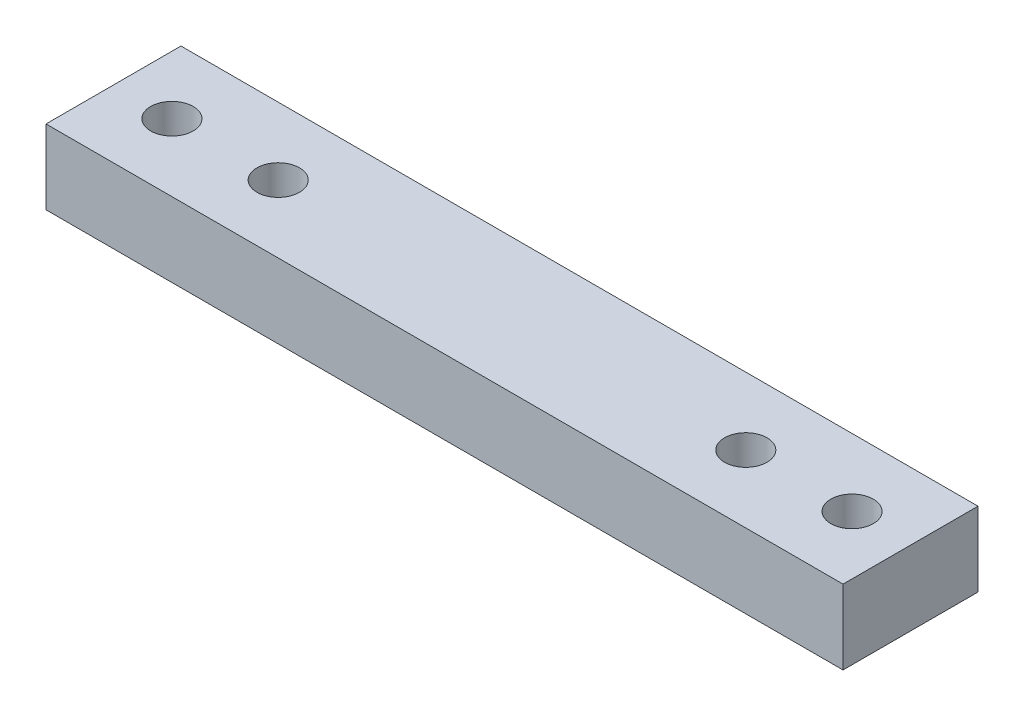
ISO-10303-21;
HEADER;
FILE_DESCRIPTION(('STEP AP214'),'2;1');
FILE_NAME('part.step','',(''),(''),'','','');
FILE_SCHEMA(('AUTOMOTIVE_DESIGN { 1 0 10303 214 1 1 1 1 }'));
ENDSEC;
DATA;
#1=APPLICATION_CONTEXT('core data for automotive mechanical design processes');
#2=APPLICATION_PROTOCOL_DEFINITION('international standard','automotive_design',2000,#1);
#3=PRODUCT_CONTEXT('',#1,'mechanical');
#4=PRODUCT('Part','Part','',(#3));
#5=PRODUCT_RELATED_PRODUCT_CATEGORY('part','',(#4));
#6=PRODUCT_DEFINITION_FORMATION('','',#4);
#7=PRODUCT_DEFINITION_CONTEXT('part definition',#1,'design');
#8=PRODUCT_DEFINITION('design','',#6,#7);
#9=PRODUCT_DEFINITION_SHAPE('','',#8);
#10=(LENGTH_UNIT() NAMED_UNIT(*) SI_UNIT(.MILLI.,.METRE.));
#11=(NAMED_UNIT(*) PLANE_ANGLE_UNIT() SI_UNIT($,.RADIAN.));
#12=(NAMED_UNIT(*) SI_UNIT($,.STERADIAN.) SOLID_ANGLE_UNIT());
#13=UNCERTAINTY_MEASURE_WITH_UNIT(LENGTH_MEASURE(1.E-05),#10,'distance_accuracy_value','');
#14=(GEOMETRIC_REPRESENTATION_CONTEXT(3) GLOBAL_UNCERTAINTY_ASSIGNED_CONTEXT((#13)) GLOBAL_UNIT_ASSIGNED_CONTEXT((#10,
#11,#12)) REPRESENTATION_CONTEXT('',''));
#15=CARTESIAN_POINT('',(0.,0.,0.));
#16=DIRECTION('',(0.,0.,1.));
#17=DIRECTION('',(1.,0.,0.));
#18=AXIS2_PLACEMENT_3D('',#15,#16,#17);
#19=CARTESIAN_POINT('',(-37.5,7.,6.35));
#20=DIRECTION('',(1.,0.,0.));
#21=DIRECTION('',(0.,0.,-1.));
#22=AXIS2_PLACEMENT_3D('',#19,#20,#21);
#23=PLANE('',#22);
#24=DIRECTION('',(0.,0.,1.));
#25=VECTOR('',#24,1.);
#26=CARTESIAN_POINT('',(-37.5,0.,6.35));
#27=LINE('',#26,#25);
#28=CARTESIAN_POINT('',(-37.5,0.,-6.35));
#29=VERTEX_POINT('',#28);
#30=CARTESIAN_POINT('',(-37.5,0.,6.35));
#31=VERTEX_POINT('',#30);
#32=EDGE_CURVE('E102',#29,#31,#27,.T.);
#33=ORIENTED_EDGE('',*,*,#32,.T.);
#34=DIRECTION('',(0.,-1.,0.));
#35=VECTOR('',#34,1.);
#36=CARTESIAN_POINT('',(-37.5,7.,6.35));
#37=LINE('',#36,#35);
#38=CARTESIAN_POINT('',(-37.5,7.,6.35));
#39=VERTEX_POINT('',#38);
#40=EDGE_CURVE('E11',#39,#31,#37,.T.);
#41=ORIENTED_EDGE('',*,*,#40,.F.);
#42=DIRECTION('',(0.,0.,1.));
#43=VECTOR('',#42,1.);
#44=CARTESIAN_POINT('',(-37.5,7.,6.35));
#45=LINE('',#44,#43);
#46=CARTESIAN_POINT('',(-37.5,7.,-6.35));
#47=VERTEX_POINT('',#46);
#48=EDGE_CURVE('E90',#47,#39,#45,.T.);
#49=ORIENTED_EDGE('',*,*,#48,.F.);
#50=DIRECTION('',(0.,-1.,0.));
#51=VECTOR('',#50,1.);
#52=CARTESIAN_POINT('',(-37.5,7.,-6.35));
#53=LINE('',#52,#51);
#54=EDGE_CURVE('E98',#47,#29,#53,.T.);
#55=ORIENTED_EDGE('',*,*,#54,.T.);
#56=EDGE_LOOP('',(#33,#41,#49,#55));
#57=FACE_BOUND('',#56,.T.);
#58=ADVANCED_FACE('F39',(#57),#23,.F.);
#59=CARTESIAN_POINT('',(-37.5,7.,6.35));
#60=DIRECTION('',(0.,0.,-1.));
#61=DIRECTION('',(-1.,0.,0.));
#62=AXIS2_PLACEMENT_3D('',#59,#60,#61);
#63=PLANE('',#62);
#64=DIRECTION('',(1.,0.,0.));
#65=VECTOR('',#64,1.);
#66=CARTESIAN_POINT('',(-37.5,0.,6.35));
#67=LINE('',#66,#65);
#68=CARTESIAN_POINT('',(37.5,0.,6.35));
#69=VERTEX_POINT('',#68);
#70=EDGE_CURVE('E94',#31,#69,#67,.T.);
#71=ORIENTED_EDGE('',*,*,#70,.T.);
#72=DIRECTION('',(0.,-1.,0.));
#73=VECTOR('',#72,1.);
#74=CARTESIAN_POINT('',(37.5,7.,6.35));
#75=LINE('',#74,#73);
#76=CARTESIAN_POINT('',(37.5,7.,6.35));
#77=VERTEX_POINT('',#76);
#78=EDGE_CURVE('E47',#77,#69,#75,.T.);
#79=ORIENTED_EDGE('',*,*,#78,.F.);
#80=DIRECTION('',(1.,0.,0.));
#81=VECTOR('',#80,1.);
#82=CARTESIAN_POINT('',(-37.5,7.,6.35));
#83=LINE('',#82,#81);
#84=EDGE_CURVE('E85',#39,#77,#83,.T.);
#85=ORIENTED_EDGE('',*,*,#84,.F.);
#86=ORIENTED_EDGE('',*,*,#40,.T.);
#87=EDGE_LOOP('',(#71,#79,#85,#86));
#88=FACE_BOUND('',#87,.T.);
#89=ADVANCED_FACE('F93',(#88),#63,.F.);
#90=CARTESIAN_POINT('',(37.5,7.,6.35));
#91=DIRECTION('',(-1.,0.,0.));
#92=DIRECTION('',(0.,0.,1.));
#93=AXIS2_PLACEMENT_3D('',#90,#91,#92);
#94=PLANE('',#93);
#95=DIRECTION('',(0.,0.,-1.));
#96=VECTOR('',#95,1.);
#97=CARTESIAN_POINT('',(37.5,0.,6.35));
#98=LINE('',#97,#96);
#99=CARTESIAN_POINT('',(37.5,0.,-6.35));
#100=VERTEX_POINT('',#99);
#101=EDGE_CURVE('E72',#69,#100,#98,.T.);
#102=ORIENTED_EDGE('',*,*,#101,.T.);
#103=DIRECTION('',(0.,-1.,0.));
#104=VECTOR('',#103,1.);
#105=CARTESIAN_POINT('',(37.5,7.,-6.35));
#106=LINE('',#105,#104);
#107=CARTESIAN_POINT('',(37.5,7.,-6.35));
#108=VERTEX_POINT('',#107);
#109=EDGE_CURVE('E95',#108,#100,#106,.T.);
#110=ORIENTED_EDGE('',*,*,#109,.F.);
#111=DIRECTION('',(0.,0.,-1.));
#112=VECTOR('',#111,1.);
#113=CARTESIAN_POINT('',(37.5,7.,6.35));
#114=LINE('',#113,#112);
#115=EDGE_CURVE('E88',#77,#108,#114,.T.);
#116=ORIENTED_EDGE('',*,*,#115,.F.);
#117=ORIENTED_EDGE('',*,*,#78,.T.);
#118=EDGE_LOOP('',(#102,#110,#116,#117));
#119=FACE_BOUND('',#118,.T.);
#120=ADVANCED_FACE('F96',(#119),#94,.F.);
#121=CARTESIAN_POINT('',(-37.5,7.,-6.35));
#122=DIRECTION('',(0.,0.,1.));
#123=DIRECTION('',(1.,0.,0.));
#124=AXIS2_PLACEMENT_3D('',#121,#122,#123);
#125=PLANE('',#124);
#126=DIRECTION('',(-1.,0.,0.));
#127=VECTOR('',#126,1.);
#128=CARTESIAN_POINT('',(-37.5,0.,-6.35));
#129=LINE('',#128,#127);
#130=EDGE_CURVE('E78',#100,#29,#129,.T.);
#131=ORIENTED_EDGE('',*,*,#130,.T.);
#132=ORIENTED_EDGE('',*,*,#54,.F.);
#133=DIRECTION('',(-1.,0.,0.));
#134=VECTOR('',#133,1.);
#135=CARTESIAN_POINT('',(-37.5,7.,-6.35));
#136=LINE('',#135,#134);
#137=EDGE_CURVE('E55',#108,#47,#136,.T.);
#138=ORIENTED_EDGE('',*,*,#137,.F.);
#139=ORIENTED_EDGE('',*,*,#109,.T.);
#140=EDGE_LOOP('',(#131,#132,#138,#139));
#141=FACE_BOUND('',#140,.T.);
#142=ADVANCED_FACE('F110',(#141),#125,.F.);
#143=CARTESIAN_POINT('',(0.,7.,0.));
#144=DIRECTION('',(0.,-1.,0.));
#145=DIRECTION('',(0.,0.,-1.));
#146=AXIS2_PLACEMENT_3D('',#143,#144,#145);
#147=PLANE('',#146);
#148=CARTESIAN_POINT('',(-32.,7.,0.));
#149=DIRECTION('',(0.,1.,0.));
#150=DIRECTION('',(0.,0.,1.));
#151=AXIS2_PLACEMENT_3D('',#148,#149,#150);
#152=CIRCLE('',#151,2.);
#153=CARTESIAN_POINT('',(-32.,7.,2.));
#154=VERTEX_POINT('',#153);
#155=EDGE_CURVE('E105',#154,#154,#152,.T.);
#156=ORIENTED_EDGE('',*,*,#155,.F.);
#157=EDGE_LOOP('',(#156));
#158=FACE_BOUND('',#157,.T.);
#159=CARTESIAN_POINT('',(-22.,7.,0.));
#160=DIRECTION('',(0.,1.,0.));
#161=DIRECTION('',(0.,0.,1.));
#162=AXIS2_PLACEMENT_3D('',#159,#160,#161);
#163=CIRCLE('',#162,2.);
#164=CARTESIAN_POINT('',(-22.,7.,2.));
#165=VERTEX_POINT('',#164);
#166=EDGE_CURVE('E128',#165,#165,#163,.T.);
#167=ORIENTED_EDGE('',*,*,#166,.F.);
#168=EDGE_LOOP('',(#167));
#169=FACE_BOUND('',#168,.T.);
#170=CARTESIAN_POINT('',(22.,7.,0.));
#171=DIRECTION('',(0.,1.,0.));
#172=DIRECTION('',(0.,0.,1.));
#173=AXIS2_PLACEMENT_3D('',#170,#171,#172);
#174=CIRCLE('',#173,2.);
#175=CARTESIAN_POINT('',(22.,7.,2.));
#176=VERTEX_POINT('',#175);
#177=EDGE_CURVE('E122',#176,#176,#174,.T.);
#178=ORIENTED_EDGE('',*,*,#177,.F.);
#179=EDGE_LOOP('',(#178));
#180=FACE_BOUND('',#179,.T.);
#181=CARTESIAN_POINT('',(32.,7.,0.));
#182=DIRECTION('',(0.,1.,0.));
#183=DIRECTION('',(0.,0.,1.));
#184=AXIS2_PLACEMENT_3D('',#181,#182,#183);
#185=CIRCLE('',#184,2.);
#186=CARTESIAN_POINT('',(32.,7.,2.));
#187=VERTEX_POINT('',#186);
#188=EDGE_CURVE('E116',#187,#187,#185,.T.);
#189=ORIENTED_EDGE('',*,*,#188,.F.);
#190=EDGE_LOOP('',(#189));
#191=FACE_BOUND('',#190,.T.);
#192=ORIENTED_EDGE('',*,*,#48,.T.);
#193=ORIENTED_EDGE('',*,*,#84,.T.);
#194=ORIENTED_EDGE('',*,*,#115,.T.);
#195=ORIENTED_EDGE('',*,*,#137,.T.);
#196=EDGE_LOOP('',(#192,#193,#194,#195));
#197=FACE_BOUND('',#196,.T.);
#198=ADVANCED_FACE('F86',(#158,#169,#180,#191,#197),#147,.F.);
#199=CARTESIAN_POINT('',(0.,0.,0.));
#200=DIRECTION('',(0.,-1.,0.));
#201=DIRECTION('',(0.,0.,-1.));
#202=AXIS2_PLACEMENT_3D('',#199,#200,#201);
#203=PLANE('',#202);
#204=CARTESIAN_POINT('',(-32.,0.,0.));
#205=DIRECTION('',(0.,1.,0.));
#206=DIRECTION('',(0.,0.,1.));
#207=AXIS2_PLACEMENT_3D('',#204,#205,#206);
#208=CIRCLE('',#207,2.);
#209=CARTESIAN_POINT('',(-32.,0.,2.));
#210=VERTEX_POINT('',#209);
#211=EDGE_CURVE('E134',#210,#210,#208,.T.);
#212=ORIENTED_EDGE('',*,*,#211,.T.);
#213=EDGE_LOOP('',(#212));
#214=FACE_BOUND('',#213,.T.);
#215=CARTESIAN_POINT('',(-22.,0.,0.));
#216=DIRECTION('',(0.,1.,0.));
#217=DIRECTION('',(0.,0.,1.));
#218=AXIS2_PLACEMENT_3D('',#215,#216,#217);
#219=CIRCLE('',#218,2.);
#220=CARTESIAN_POINT('',(-22.,0.,2.));
#221=VERTEX_POINT('',#220);
#222=EDGE_CURVE('E131',#221,#221,#219,.T.);
#223=ORIENTED_EDGE('',*,*,#222,.T.);
#224=EDGE_LOOP('',(#223));
#225=FACE_BOUND('',#224,.T.);
#226=CARTESIAN_POINT('',(22.,0.,0.));
#227=DIRECTION('',(0.,1.,0.));
#228=DIRECTION('',(0.,0.,1.));
#229=AXIS2_PLACEMENT_3D('',#226,#227,#228);
#230=CIRCLE('',#229,2.);
#231=CARTESIAN_POINT('',(22.,0.,2.));
#232=VERTEX_POINT('',#231);
#233=EDGE_CURVE('E125',#232,#232,#230,.T.);
#234=ORIENTED_EDGE('',*,*,#233,.T.);
#235=EDGE_LOOP('',(#234));
#236=FACE_BOUND('',#235,.T.);
#237=CARTESIAN_POINT('',(32.,0.,0.));
#238=DIRECTION('',(0.,1.,0.));
#239=DIRECTION('',(0.,0.,1.));
#240=AXIS2_PLACEMENT_3D('',#237,#238,#239);
#241=CIRCLE('',#240,2.);
#242=CARTESIAN_POINT('',(32.,0.,2.));
#243=VERTEX_POINT('',#242);
#244=EDGE_CURVE('E119',#243,#243,#241,.T.);
#245=ORIENTED_EDGE('',*,*,#244,.T.);
#246=EDGE_LOOP('',(#245));
#247=FACE_BOUND('',#246,.T.);
#248=ORIENTED_EDGE('',*,*,#32,.F.);
#249=ORIENTED_EDGE('',*,*,#130,.F.);
#250=ORIENTED_EDGE('',*,*,#101,.F.);
#251=ORIENTED_EDGE('',*,*,#70,.F.);
#252=EDGE_LOOP('',(#248,#249,#250,#251));
#253=FACE_BOUND('',#252,.T.);
#254=ADVANCED_FACE('F113',(#214,#225,#236,#247,#253),#203,.T.);
#255=CARTESIAN_POINT('',(32.,7.,0.));
#256=DIRECTION('',(0.,-1.,0.));
#257=DIRECTION('',(0.,0.,-1.));
#258=AXIS2_PLACEMENT_3D('',#255,#256,#257);
#259=CYLINDRICAL_SURFACE('',#258,2.);
#260=ORIENTED_EDGE('',*,*,#188,.T.);
#261=EDGE_LOOP('',(#260));
#262=FACE_BOUND('',#261,.T.);
#263=ORIENTED_EDGE('',*,*,#244,.F.);
#264=EDGE_LOOP('',(#263));
#265=FACE_BOUND('',#264,.T.);
#266=ADVANCED_FACE('F152',(#262,#265),#259,.F.);
#267=CARTESIAN_POINT('',(22.,7.,0.));
#268=DIRECTION('',(0.,-1.,0.));
#269=DIRECTION('',(0.,0.,-1.));
#270=AXIS2_PLACEMENT_3D('',#267,#268,#269);
#271=CYLINDRICAL_SURFACE('',#270,2.);
#272=ORIENTED_EDGE('',*,*,#177,.T.);
#273=EDGE_LOOP('',(#272));
#274=FACE_BOUND('',#273,.T.);
#275=ORIENTED_EDGE('',*,*,#233,.F.);
#276=EDGE_LOOP('',(#275));
#277=FACE_BOUND('',#276,.T.);
#278=ADVANCED_FACE('F155',(#274,#277),#271,.F.);
#279=CARTESIAN_POINT('',(-22.,7.,0.));
#280=DIRECTION('',(0.,-1.,0.));
#281=DIRECTION('',(0.,0.,-1.));
#282=AXIS2_PLACEMENT_3D('',#279,#280,#281);
#283=CYLINDRICAL_SURFACE('',#282,2.);
#284=ORIENTED_EDGE('',*,*,#166,.T.);
#285=EDGE_LOOP('',(#284));
#286=FACE_BOUND('',#285,.T.);
#287=ORIENTED_EDGE('',*,*,#222,.F.);
#288=EDGE_LOOP('',(#287));
#289=FACE_BOUND('',#288,.T.);
#290=ADVANCED_FACE('F205',(#286,#289),#283,.F.);
#291=CARTESIAN_POINT('',(-32.,7.,0.));
#292=DIRECTION('',(0.,-1.,0.));
#293=DIRECTION('',(0.,0.,-1.));
#294=AXIS2_PLACEMENT_3D('',#291,#292,#293);
#295=CYLINDRICAL_SURFACE('',#294,2.);
#296=ORIENTED_EDGE('',*,*,#155,.T.);
#297=EDGE_LOOP('',(#296));
#298=FACE_BOUND('',#297,.T.);
#299=ORIENTED_EDGE('',*,*,#211,.F.);
#300=EDGE_LOOP('',(#299));
#301=FACE_BOUND('',#300,.T.);
#302=ADVANCED_FACE('F140',(#298,#301),#295,.F.);
#303=CLOSED_SHELL('',(#58,#89,#120,#142,#198,#254,#266,#278,#290,#302));
#304=MANIFOLD_SOLID_BREP('B2',#303);
#305=ADVANCED_BREP_SHAPE_REPRESENTATION('',(#18,#304),#14);
#306=SHAPE_DEFINITION_REPRESENTATION(#9,#305);
ENDSEC;
END-ISO-10303-21;
